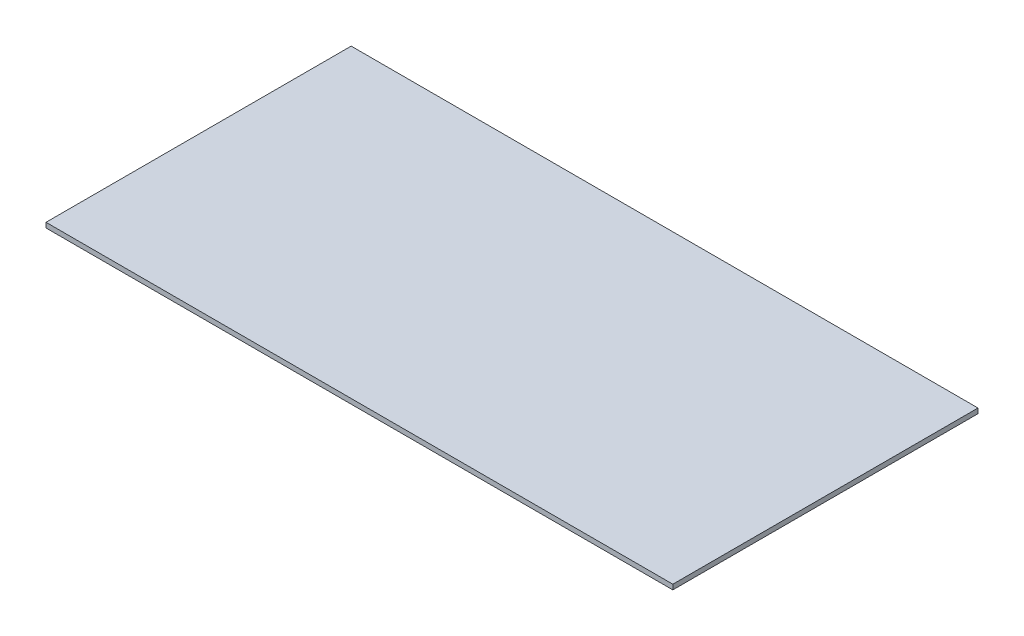
ISO-10303-21;
HEADER;
FILE_DESCRIPTION(('STEP AP214'),'2;1');
FILE_NAME('part.step','',(''),(''),'','','');
FILE_SCHEMA(('AUTOMOTIVE_DESIGN { 1 0 10303 214 1 1 1 1 }'));
ENDSEC;
DATA;
#1=APPLICATION_CONTEXT('core data for automotive mechanical design processes');
#2=APPLICATION_PROTOCOL_DEFINITION('international standard','automotive_design',2000,#1);
#3=PRODUCT_CONTEXT('',#1,'mechanical');
#4=PRODUCT('Part','Part','',(#3));
#5=PRODUCT_RELATED_PRODUCT_CATEGORY('part','',(#4));
#6=PRODUCT_DEFINITION_FORMATION('','',#4);
#7=PRODUCT_DEFINITION_CONTEXT('part definition',#1,'design');
#8=PRODUCT_DEFINITION('design','',#6,#7);
#9=PRODUCT_DEFINITION_SHAPE('','',#8);
#10=(LENGTH_UNIT() NAMED_UNIT(*) SI_UNIT(.MILLI.,.METRE.));
#11=(NAMED_UNIT(*) PLANE_ANGLE_UNIT() SI_UNIT($,.RADIAN.));
#12=(NAMED_UNIT(*) SI_UNIT($,.STERADIAN.) SOLID_ANGLE_UNIT());
#13=UNCERTAINTY_MEASURE_WITH_UNIT(LENGTH_MEASURE(1.E-05),#10,'distance_accuracy_value','');
#14=(GEOMETRIC_REPRESENTATION_CONTEXT(3) GLOBAL_UNCERTAINTY_ASSIGNED_CONTEXT((#13)) GLOBAL_UNIT_ASSIGNED_CONTEXT((#10,
#11,#12)) REPRESENTATION_CONTEXT('',''));
#15=CARTESIAN_POINT('',(0.,0.,0.));
#16=DIRECTION('',(0.,0.,1.));
#17=DIRECTION('',(1.,0.,0.));
#18=AXIS2_PLACEMENT_3D('',#15,#16,#17);
#19=CARTESIAN_POINT('',(0.,1.5,0.));
#20=DIRECTION('',(1.,0.,0.));
#21=DIRECTION('',(0.,0.,-1.));
#22=AXIS2_PLACEMENT_3D('',#19,#20,#21);
#23=PLANE('',#22);
#24=DIRECTION('',(0.,0.,1.));
#25=VECTOR('',#24,1.);
#26=CARTESIAN_POINT('',(0.,0.,0.));
#27=LINE('',#26,#25);
#28=CARTESIAN_POINT('',(0.,0.,-92.5));
#29=VERTEX_POINT('',#28);
#30=CARTESIAN_POINT('',(0.,0.,0.));
#31=VERTEX_POINT('',#30);
#32=EDGE_CURVE('E102',#29,#31,#27,.T.);
#33=ORIENTED_EDGE('',*,*,#32,.T.);
#34=DIRECTION('',(0.,-1.,0.));
#35=VECTOR('',#34,1.);
#36=CARTESIAN_POINT('',(0.,1.5,0.));
#37=LINE('',#36,#35);
#38=CARTESIAN_POINT('',(0.,1.5,0.));
#39=VERTEX_POINT('',#38);
#40=EDGE_CURVE('E11',#39,#31,#37,.T.);
#41=ORIENTED_EDGE('',*,*,#40,.F.);
#42=DIRECTION('',(0.,0.,1.));
#43=VECTOR('',#42,1.);
#44=CARTESIAN_POINT('',(0.,1.5,0.));
#45=LINE('',#44,#43);
#46=CARTESIAN_POINT('',(0.,1.5,-92.5));
#47=VERTEX_POINT('',#46);
#48=EDGE_CURVE('E90',#47,#39,#45,.T.);
#49=ORIENTED_EDGE('',*,*,#48,.F.);
#50=DIRECTION('',(0.,-1.,0.));
#51=VECTOR('',#50,1.);
#52=CARTESIAN_POINT('',(0.,1.5,-92.5));
#53=LINE('',#52,#51);
#54=EDGE_CURVE('E98',#47,#29,#53,.T.);
#55=ORIENTED_EDGE('',*,*,#54,.T.);
#56=EDGE_LOOP('',(#33,#41,#49,#55));
#57=FACE_BOUND('',#56,.T.);
#58=ADVANCED_FACE('F39',(#57),#23,.F.);
#59=CARTESIAN_POINT('',(0.,1.5,0.));
#60=DIRECTION('',(0.,0.,-1.));
#61=DIRECTION('',(-1.,0.,0.));
#62=AXIS2_PLACEMENT_3D('',#59,#60,#61);
#63=PLANE('',#62);
#64=DIRECTION('',(1.,0.,0.));
#65=VECTOR('',#64,1.);
#66=CARTESIAN_POINT('',(0.,0.,0.));
#67=LINE('',#66,#65);
#68=CARTESIAN_POINT('',(190.,0.,0.));
#69=VERTEX_POINT('',#68);
#70=EDGE_CURVE('E94',#31,#69,#67,.T.);
#71=ORIENTED_EDGE('',*,*,#70,.T.);
#72=DIRECTION('',(0.,-1.,0.));
#73=VECTOR('',#72,1.);
#74=CARTESIAN_POINT('',(190.,1.5,0.));
#75=LINE('',#74,#73);
#76=CARTESIAN_POINT('',(190.,1.5,0.));
#77=VERTEX_POINT('',#76);
#78=EDGE_CURVE('E47',#77,#69,#75,.T.);
#79=ORIENTED_EDGE('',*,*,#78,.F.);
#80=DIRECTION('',(1.,0.,0.));
#81=VECTOR('',#80,1.);
#82=CARTESIAN_POINT('',(0.,1.5,0.));
#83=LINE('',#82,#81);
#84=EDGE_CURVE('E85',#39,#77,#83,.T.);
#85=ORIENTED_EDGE('',*,*,#84,.F.);
#86=ORIENTED_EDGE('',*,*,#40,.T.);
#87=EDGE_LOOP('',(#71,#79,#85,#86));
#88=FACE_BOUND('',#87,.T.);
#89=ADVANCED_FACE('F93',(#88),#63,.F.);
#90=CARTESIAN_POINT('',(190.,1.5,0.));
#91=DIRECTION('',(-1.,0.,0.));
#92=DIRECTION('',(0.,0.,1.));
#93=AXIS2_PLACEMENT_3D('',#90,#91,#92);
#94=PLANE('',#93);
#95=DIRECTION('',(0.,0.,-1.));
#96=VECTOR('',#95,1.);
#97=CARTESIAN_POINT('',(190.,0.,0.));
#98=LINE('',#97,#96);
#99=CARTESIAN_POINT('',(190.,0.,-92.5));
#100=VERTEX_POINT('',#99);
#101=EDGE_CURVE('E72',#69,#100,#98,.T.);
#102=ORIENTED_EDGE('',*,*,#101,.T.);
#103=DIRECTION('',(0.,-1.,0.));
#104=VECTOR('',#103,1.);
#105=CARTESIAN_POINT('',(190.,1.5,-92.5));
#106=LINE('',#105,#104);
#107=CARTESIAN_POINT('',(190.,1.5,-92.5));
#108=VERTEX_POINT('',#107);
#109=EDGE_CURVE('E95',#108,#100,#106,.T.);
#110=ORIENTED_EDGE('',*,*,#109,.F.);
#111=DIRECTION('',(0.,0.,-1.));
#112=VECTOR('',#111,1.);
#113=CARTESIAN_POINT('',(190.,1.5,0.));
#114=LINE('',#113,#112);
#115=EDGE_CURVE('E88',#77,#108,#114,.T.);
#116=ORIENTED_EDGE('',*,*,#115,.F.);
#117=ORIENTED_EDGE('',*,*,#78,.T.);
#118=EDGE_LOOP('',(#102,#110,#116,#117));
#119=FACE_BOUND('',#118,.T.);
#120=ADVANCED_FACE('F96',(#119),#94,.F.);
#121=CARTESIAN_POINT('',(0.,1.5,-92.5));
#122=DIRECTION('',(0.,0.,1.));
#123=DIRECTION('',(1.,0.,0.));
#124=AXIS2_PLACEMENT_3D('',#121,#122,#123);
#125=PLANE('',#124);
#126=DIRECTION('',(-1.,0.,0.));
#127=VECTOR('',#126,1.);
#128=CARTESIAN_POINT('',(0.,0.,-92.5));
#129=LINE('',#128,#127);
#130=EDGE_CURVE('E78',#100,#29,#129,.T.);
#131=ORIENTED_EDGE('',*,*,#130,.T.);
#132=ORIENTED_EDGE('',*,*,#54,.F.);
#133=DIRECTION('',(-1.,0.,0.));
#134=VECTOR('',#133,1.);
#135=CARTESIAN_POINT('',(0.,1.5,-92.5));
#136=LINE('',#135,#134);
#137=EDGE_CURVE('E55',#108,#47,#136,.T.);
#138=ORIENTED_EDGE('',*,*,#137,.F.);
#139=ORIENTED_EDGE('',*,*,#109,.T.);
#140=EDGE_LOOP('',(#131,#132,#138,#139));
#141=FACE_BOUND('',#140,.T.);
#142=ADVANCED_FACE('F109',(#141),#125,.F.);
#143=CARTESIAN_POINT('',(0.,1.5,0.));
#144=DIRECTION('',(0.,-1.,0.));
#145=DIRECTION('',(0.,0.,-1.));
#146=AXIS2_PLACEMENT_3D('',#143,#144,#145);
#147=PLANE('',#146);
#148=ORIENTED_EDGE('',*,*,#48,.T.);
#149=ORIENTED_EDGE('',*,*,#84,.T.);
#150=ORIENTED_EDGE('',*,*,#115,.T.);
#151=ORIENTED_EDGE('',*,*,#137,.T.);
#152=EDGE_LOOP('',(#148,#149,#150,#151));
#153=FACE_BOUND('',#152,.T.);
#154=ADVANCED_FACE('F86',(#153),#147,.F.);
#155=CARTESIAN_POINT('',(0.,0.,0.));
#156=DIRECTION('',(0.,-1.,0.));
#157=DIRECTION('',(0.,0.,-1.));
#158=AXIS2_PLACEMENT_3D('',#155,#156,#157);
#159=PLANE('',#158);
#160=ORIENTED_EDGE('',*,*,#32,.F.);
#161=ORIENTED_EDGE('',*,*,#130,.F.);
#162=ORIENTED_EDGE('',*,*,#101,.F.);
#163=ORIENTED_EDGE('',*,*,#70,.F.);
#164=EDGE_LOOP('',(#160,#161,#162,#163));
#165=FACE_BOUND('',#164,.T.);
#166=ADVANCED_FACE('F112',(#165),#159,.T.);
#167=CLOSED_SHELL('',(#58,#89,#120,#142,#154,#166));
#168=MANIFOLD_SOLID_BREP('B2',#167);
#169=ADVANCED_BREP_SHAPE_REPRESENTATION('',(#18,#168),#14);
#170=SHAPE_DEFINITION_REPRESENTATION(#9,#169);
ENDSEC;
END-ISO-10303-21;
